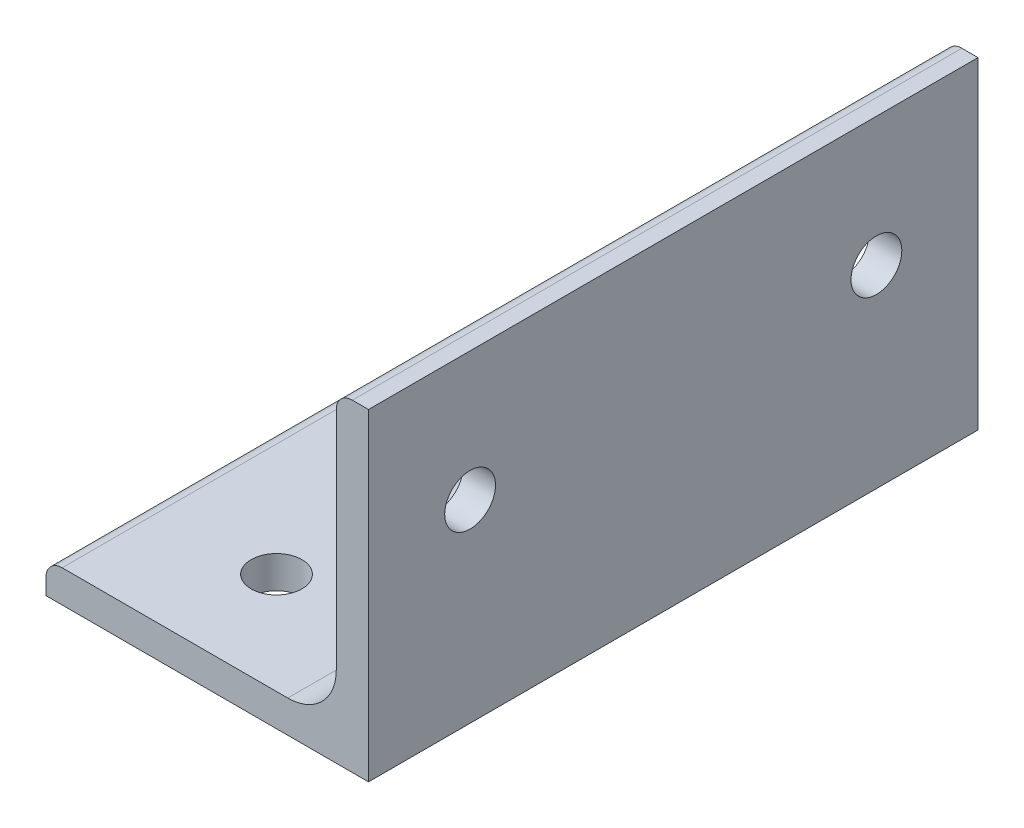
ISO-10303-21;
HEADER;
FILE_DESCRIPTION(('STEP AP214'),'2;1');
FILE_NAME('part.step','',(''),(''),'','','');
FILE_SCHEMA(('AUTOMOTIVE_DESIGN { 1 0 10303 214 1 1 1 1 }'));
ENDSEC;
DATA;
#1=APPLICATION_CONTEXT('core data for automotive mechanical design processes');
#2=APPLICATION_PROTOCOL_DEFINITION('international standard','automotive_design',2000,#1);
#3=PRODUCT_CONTEXT('',#1,'mechanical');
#4=PRODUCT('Part','Part','',(#3));
#5=PRODUCT_RELATED_PRODUCT_CATEGORY('part','',(#4));
#6=PRODUCT_DEFINITION_FORMATION('','',#4);
#7=PRODUCT_DEFINITION_CONTEXT('part definition',#1,'design');
#8=PRODUCT_DEFINITION('design','',#6,#7);
#9=PRODUCT_DEFINITION_SHAPE('','',#8);
#10=(LENGTH_UNIT() NAMED_UNIT(*) SI_UNIT(.MILLI.,.METRE.));
#11=(NAMED_UNIT(*) PLANE_ANGLE_UNIT() SI_UNIT($,.RADIAN.));
#12=(NAMED_UNIT(*) SI_UNIT($,.STERADIAN.) SOLID_ANGLE_UNIT());
#13=UNCERTAINTY_MEASURE_WITH_UNIT(LENGTH_MEASURE(1.E-05),#10,'distance_accuracy_value','');
#14=(GEOMETRIC_REPRESENTATION_CONTEXT(3) GLOBAL_UNCERTAINTY_ASSIGNED_CONTEXT((#13)) GLOBAL_UNIT_ASSIGNED_CONTEXT((#10,
#11,#12)) REPRESENTATION_CONTEXT('',''));
#15=CARTESIAN_POINT('',(0.,0.,0.));
#16=DIRECTION('',(0.,0.,1.));
#17=DIRECTION('',(1.,0.,0.));
#18=AXIS2_PLACEMENT_3D('',#15,#16,#17);
#19=CARTESIAN_POINT('',(-15.875,-14.2875,304.8));
#20=DIRECTION('',(1.,0.,0.));
#21=DIRECTION('',(0.,0.,-1.));
#22=AXIS2_PLACEMENT_3D('',#19,#20,#21);
#23=PLANE('',#22);
#24=DIRECTION('',(0.,1.,0.));
#25=VECTOR('',#24,1.);
#26=CARTESIAN_POINT('',(-15.875,-14.2875,244.8));
#27=LINE('',#26,#25);
#28=CARTESIAN_POINT('',(-15.875,-15.875,244.8));
#29=VERTEX_POINT('',#28);
#30=CARTESIAN_POINT('',(-15.875,-14.2875,244.8));
#31=VERTEX_POINT('',#30);
#32=EDGE_CURVE('E54',#29,#31,#27,.T.);
#33=ORIENTED_EDGE('',*,*,#32,.F.);
#34=DIRECTION('',(0.,0.,-1.));
#35=VECTOR('',#34,1.);
#36=CARTESIAN_POINT('',(-15.875,-15.875,304.8));
#37=LINE('',#36,#35);
#38=CARTESIAN_POINT('',(-15.875,-15.875,304.8));
#39=VERTEX_POINT('',#38);
#40=EDGE_CURVE('E48',#39,#29,#37,.T.);
#41=ORIENTED_EDGE('',*,*,#40,.F.);
#42=DIRECTION('',(0.,-1.,0.));
#43=VECTOR('',#42,1.);
#44=CARTESIAN_POINT('',(-15.875,-14.2875,304.8));
#45=LINE('',#44,#43);
#46=CARTESIAN_POINT('',(-15.875,-14.2875,304.8));
#47=VERTEX_POINT('',#46);
#48=EDGE_CURVE('E168',#47,#39,#45,.T.);
#49=ORIENTED_EDGE('',*,*,#48,.F.);
#50=DIRECTION('',(0.,0.,-1.));
#51=VECTOR('',#50,1.);
#52=CARTESIAN_POINT('',(-15.875,-14.2875,304.8));
#53=LINE('',#52,#51);
#54=EDGE_CURVE('E151',#47,#31,#53,.T.);
#55=ORIENTED_EDGE('',*,*,#54,.T.);
#56=EDGE_LOOP('',(#33,#41,#49,#55));
#57=FACE_BOUND('',#56,.T.);
#58=ADVANCED_FACE('F41',(#57),#23,.F.);
#59=CARTESIAN_POINT('',(-15.875,-15.875,304.8));
#60=DIRECTION('',(0.,1.,0.));
#61=DIRECTION('',(-1.,0.,0.));
#62=AXIS2_PLACEMENT_3D('',#59,#60,#61);
#63=PLANE('',#62);
#64=CARTESIAN_POINT('',(-3.18135,-15.875,254.8));
#65=DIRECTION('',(0.,1.,0.));
#66=DIRECTION('',(-1.,0.,0.));
#67=AXIS2_PLACEMENT_3D('',#64,#65,#66);
#68=CIRCLE('',#67,2.5);
#69=CARTESIAN_POINT('',(-5.68135,-15.875,254.8));
#70=VERTEX_POINT('',#69);
#71=EDGE_CURVE('E188',#70,#70,#68,.T.);
#72=ORIENTED_EDGE('',*,*,#71,.T.);
#73=EDGE_LOOP('',(#72));
#74=FACE_BOUND('',#73,.T.);
#75=CARTESIAN_POINT('',(-3.18135,-15.875,294.8));
#76=DIRECTION('',(0.,1.,0.));
#77=DIRECTION('',(-1.,0.,0.));
#78=AXIS2_PLACEMENT_3D('',#75,#76,#77);
#79=CIRCLE('',#78,2.5);
#80=CARTESIAN_POINT('',(-5.68134999999999,-15.875,294.8));
#81=VERTEX_POINT('',#80);
#82=EDGE_CURVE('E193',#81,#81,#79,.T.);
#83=ORIENTED_EDGE('',*,*,#82,.T.);
#84=EDGE_LOOP('',(#83));
#85=FACE_BOUND('',#84,.T.);
#86=DIRECTION('',(1.,0.,0.));
#87=VECTOR('',#86,1.);
#88=CARTESIAN_POINT('',(15.875,-15.875,244.8));
#89=LINE('',#88,#87);
#90=CARTESIAN_POINT('',(15.875,-15.875,244.8));
#91=VERTEX_POINT('',#90);
#92=EDGE_CURVE('E112',#29,#91,#89,.T.);
#93=ORIENTED_EDGE('',*,*,#92,.T.);
#94=DIRECTION('',(0.,0.,-1.));
#95=VECTOR('',#94,1.);
#96=CARTESIAN_POINT('',(15.875,-15.875,304.8));
#97=LINE('',#96,#95);
#98=CARTESIAN_POINT('',(15.875,-15.875,304.8));
#99=VERTEX_POINT('',#98);
#100=EDGE_CURVE('E125',#99,#91,#97,.T.);
#101=ORIENTED_EDGE('',*,*,#100,.F.);
#102=DIRECTION('',(1.,0.,0.));
#103=VECTOR('',#102,1.);
#104=CARTESIAN_POINT('',(-15.875,-15.875,304.8));
#105=LINE('',#104,#103);
#106=EDGE_CURVE('E166',#39,#99,#105,.T.);
#107=ORIENTED_EDGE('',*,*,#106,.F.);
#108=ORIENTED_EDGE('',*,*,#40,.T.);
#109=EDGE_LOOP('',(#93,#101,#107,#108));
#110=FACE_BOUND('',#109,.T.);
#111=ADVANCED_FACE('F124',(#74,#85,#110),#63,.F.);
#112=CARTESIAN_POINT('',(15.875,-15.875,304.8));
#113=DIRECTION('',(-1.,0.,0.));
#114=DIRECTION('',(0.,-1.,0.));
#115=AXIS2_PLACEMENT_3D('',#112,#113,#114);
#116=PLANE('',#115);
#117=CARTESIAN_POINT('',(15.875,3.18135,294.8));
#118=DIRECTION('',(-1.,0.,0.));
#119=DIRECTION('',(0.,-1.,0.));
#120=AXIS2_PLACEMENT_3D('',#117,#118,#119);
#121=CIRCLE('',#120,2.50000000000002);
#122=CARTESIAN_POINT('',(15.875,0.681349999999979,294.8));
#123=VERTEX_POINT('',#122);
#124=EDGE_CURVE('E119',#123,#123,#121,.T.);
#125=ORIENTED_EDGE('',*,*,#124,.T.);
#126=EDGE_LOOP('',(#125));
#127=FACE_BOUND('',#126,.T.);
#128=CARTESIAN_POINT('',(15.875,3.18135,254.8));
#129=DIRECTION('',(-1.,0.,0.));
#130=DIRECTION('',(0.,-1.,0.));
#131=AXIS2_PLACEMENT_3D('',#128,#129,#130);
#132=CIRCLE('',#131,2.50000000000002);
#133=CARTESIAN_POINT('',(15.875,0.681349999999979,254.8));
#134=VERTEX_POINT('',#133);
#135=EDGE_CURVE('E181',#134,#134,#132,.T.);
#136=ORIENTED_EDGE('',*,*,#135,.T.);
#137=EDGE_LOOP('',(#136));
#138=FACE_BOUND('',#137,.T.);
#139=DIRECTION('',(0.,1.,0.));
#140=VECTOR('',#139,1.);
#141=CARTESIAN_POINT('',(15.875,-15.875,244.8));
#142=LINE('',#141,#140);
#143=CARTESIAN_POINT('',(15.875,15.875,244.8));
#144=VERTEX_POINT('',#143);
#145=EDGE_CURVE('E109',#91,#144,#142,.T.);
#146=ORIENTED_EDGE('',*,*,#145,.T.);
#147=DIRECTION('',(0.,0.,-1.));
#148=VECTOR('',#147,1.);
#149=CARTESIAN_POINT('',(15.875,15.875,304.8));
#150=LINE('',#149,#148);
#151=CARTESIAN_POINT('',(15.875,15.875,304.8));
#152=VERTEX_POINT('',#151);
#153=EDGE_CURVE('E132',#152,#144,#150,.T.);
#154=ORIENTED_EDGE('',*,*,#153,.F.);
#155=DIRECTION('',(0.,1.,0.));
#156=VECTOR('',#155,1.);
#157=CARTESIAN_POINT('',(15.875,-15.875,304.8));
#158=LINE('',#157,#156);
#159=EDGE_CURVE('E131',#99,#152,#158,.T.);
#160=ORIENTED_EDGE('',*,*,#159,.F.);
#161=ORIENTED_EDGE('',*,*,#100,.T.);
#162=EDGE_LOOP('',(#146,#154,#160,#161));
#163=FACE_BOUND('',#162,.T.);
#164=ADVANCED_FACE('F130',(#127,#138,#163),#116,.F.);
#165=CARTESIAN_POINT('',(14.2875,15.875,304.8));
#166=DIRECTION('',(0.,-1.,0.));
#167=DIRECTION('',(1.,0.,0.));
#168=AXIS2_PLACEMENT_3D('',#165,#166,#167);
#169=PLANE('',#168);
#170=DIRECTION('',(1.,0.,0.));
#171=VECTOR('',#170,1.);
#172=CARTESIAN_POINT('',(14.2875,15.875,244.8));
#173=LINE('',#172,#171);
#174=CARTESIAN_POINT('',(14.2875,15.875,244.8));
#175=VERTEX_POINT('',#174);
#176=EDGE_CURVE('E114',#175,#144,#173,.T.);
#177=ORIENTED_EDGE('',*,*,#176,.F.);
#178=DIRECTION('',(0.,0.,-1.));
#179=VECTOR('',#178,1.);
#180=CARTESIAN_POINT('',(14.2875,15.875,304.8));
#181=LINE('',#180,#179);
#182=CARTESIAN_POINT('',(14.2875,15.875,304.8));
#183=VERTEX_POINT('',#182);
#184=EDGE_CURVE('E134',#183,#175,#181,.T.);
#185=ORIENTED_EDGE('',*,*,#184,.F.);
#186=DIRECTION('',(-1.,0.,0.));
#187=VECTOR('',#186,1.);
#188=CARTESIAN_POINT('',(14.2875,15.875,304.8));
#189=LINE('',#188,#187);
#190=EDGE_CURVE('E163',#152,#183,#189,.T.);
#191=ORIENTED_EDGE('',*,*,#190,.F.);
#192=ORIENTED_EDGE('',*,*,#153,.T.);
#193=EDGE_LOOP('',(#177,#185,#191,#192));
#194=FACE_BOUND('',#193,.T.);
#195=ADVANCED_FACE('F226',(#194),#169,.F.);
#196=CARTESIAN_POINT('',(14.2875,14.2875,304.8));
#197=DIRECTION('',(0.,0.,-1.));
#198=DIRECTION('',(-1.,0.,0.));
#199=AXIS2_PLACEMENT_3D('',#196,#197,#198);
#200=CYLINDRICAL_SURFACE('',#199,1.5875);
#201=CARTESIAN_POINT('',(14.2875,14.2875,244.8));
#202=DIRECTION('',(0.,0.,-1.));
#203=DIRECTION('',(-1.,0.,0.));
#204=AXIS2_PLACEMENT_3D('',#201,#202,#203);
#205=CIRCLE('',#204,1.5875);
#206=CARTESIAN_POINT('',(12.7,14.2875,244.8));
#207=VERTEX_POINT('',#206);
#208=EDGE_CURVE('E172',#207,#175,#205,.T.);
#209=ORIENTED_EDGE('',*,*,#208,.F.);
#210=DIRECTION('',(0.,0.,-1.));
#211=VECTOR('',#210,1.);
#212=CARTESIAN_POINT('',(12.7,14.2875,304.8));
#213=LINE('',#212,#211);
#214=CARTESIAN_POINT('',(12.7,14.2875,304.8));
#215=VERTEX_POINT('',#214);
#216=EDGE_CURVE('E139',#215,#207,#213,.T.);
#217=ORIENTED_EDGE('',*,*,#216,.F.);
#218=CARTESIAN_POINT('',(14.2875,14.2875,304.8));
#219=DIRECTION('',(0.,0.,1.));
#220=DIRECTION('',(-1.,0.,0.));
#221=AXIS2_PLACEMENT_3D('',#218,#219,#220);
#222=CIRCLE('',#221,1.5875);
#223=EDGE_CURVE('E161',#183,#215,#222,.T.);
#224=ORIENTED_EDGE('',*,*,#223,.F.);
#225=ORIENTED_EDGE('',*,*,#184,.T.);
#226=EDGE_LOOP('',(#209,#217,#224,#225));
#227=FACE_BOUND('',#226,.T.);
#228=ADVANCED_FACE('F231',(#227),#200,.T.);
#229=CARTESIAN_POINT('',(12.7,14.2875,304.8));
#230=DIRECTION('',(1.,0.,0.));
#231=DIRECTION('',(0.,1.,0.));
#232=AXIS2_PLACEMENT_3D('',#229,#230,#231);
#233=PLANE('',#232);
#234=CARTESIAN_POINT('',(12.7,3.18135,294.8));
#235=DIRECTION('',(-1.,0.,0.));
#236=DIRECTION('',(0.,-1.,0.));
#237=AXIS2_PLACEMENT_3D('',#234,#235,#236);
#238=CIRCLE('',#237,2.50000000000002);
#239=CARTESIAN_POINT('',(12.7,0.681349999999978,294.8));
#240=VERTEX_POINT('',#239);
#241=EDGE_CURVE('E184',#240,#240,#238,.T.);
#242=ORIENTED_EDGE('',*,*,#241,.F.);
#243=EDGE_LOOP('',(#242));
#244=FACE_BOUND('',#243,.T.);
#245=CARTESIAN_POINT('',(12.7,3.18135,254.8));
#246=DIRECTION('',(-1.,0.,0.));
#247=DIRECTION('',(0.,-1.,0.));
#248=AXIS2_PLACEMENT_3D('',#245,#246,#247);
#249=CIRCLE('',#248,2.50000000000002);
#250=CARTESIAN_POINT('',(12.7,0.681349999999978,254.8));
#251=VERTEX_POINT('',#250);
#252=EDGE_CURVE('E185',#251,#251,#249,.T.);
#253=ORIENTED_EDGE('',*,*,#252,.F.);
#254=EDGE_LOOP('',(#253));
#255=FACE_BOUND('',#254,.T.);
#256=DIRECTION('',(0.,1.,0.));
#257=VECTOR('',#256,1.);
#258=CARTESIAN_POINT('',(12.7,14.2875,244.8));
#259=LINE('',#258,#257);
#260=CARTESIAN_POINT('',(12.7,-7.9248,244.8));
#261=VERTEX_POINT('',#260);
#262=EDGE_CURVE('E174',#261,#207,#259,.T.);
#263=ORIENTED_EDGE('',*,*,#262,.F.);
#264=DIRECTION('',(0.,0.,-1.));
#265=VECTOR('',#264,1.);
#266=CARTESIAN_POINT('',(12.7,-7.9248,304.8));
#267=LINE('',#266,#265);
#268=CARTESIAN_POINT('',(12.7,-7.9248,304.8));
#269=VERTEX_POINT('',#268);
#270=EDGE_CURVE('E142',#269,#261,#267,.T.);
#271=ORIENTED_EDGE('',*,*,#270,.F.);
#272=DIRECTION('',(0.,-1.,0.));
#273=VECTOR('',#272,1.);
#274=CARTESIAN_POINT('',(12.7,14.2875,304.8));
#275=LINE('',#274,#273);
#276=EDGE_CURVE('E159',#215,#269,#275,.T.);
#277=ORIENTED_EDGE('',*,*,#276,.F.);
#278=ORIENTED_EDGE('',*,*,#216,.T.);
#279=EDGE_LOOP('',(#263,#271,#277,#278));
#280=FACE_BOUND('',#279,.T.);
#281=ADVANCED_FACE('F237',(#244,#255,#280),#233,.F.);
#282=CARTESIAN_POINT('',(7.92480000000001,-7.9248,304.8));
#283=DIRECTION('',(0.,0.,-1.));
#284=DIRECTION('',(-1.,0.,0.));
#285=AXIS2_PLACEMENT_3D('',#282,#283,#284);
#286=CYLINDRICAL_SURFACE('',#285,4.7752);
#287=CARTESIAN_POINT('',(7.92480000000001,-7.9248,244.8));
#288=DIRECTION('',(0.,0.,-1.));
#289=DIRECTION('',(-1.,0.,0.));
#290=AXIS2_PLACEMENT_3D('',#287,#288,#289);
#291=CIRCLE('',#290,4.7752);
#292=CARTESIAN_POINT('',(7.92480000000001,-12.7,244.8));
#293=VERTEX_POINT('',#292);
#294=EDGE_CURVE('E176',#293,#261,#291,.F.);
#295=ORIENTED_EDGE('',*,*,#294,.F.);
#296=DIRECTION('',(0.,0.,-1.));
#297=VECTOR('',#296,1.);
#298=CARTESIAN_POINT('',(7.92480000000001,-12.7,304.8));
#299=LINE('',#298,#297);
#300=CARTESIAN_POINT('',(7.92480000000001,-12.7,304.8));
#301=VERTEX_POINT('',#300);
#302=EDGE_CURVE('E145',#301,#293,#299,.T.);
#303=ORIENTED_EDGE('',*,*,#302,.F.);
#304=CARTESIAN_POINT('',(7.92480000000001,-7.9248,304.8));
#305=DIRECTION('',(0.,0.,-1.));
#306=DIRECTION('',(-1.,0.,0.));
#307=AXIS2_PLACEMENT_3D('',#304,#305,#306);
#308=CIRCLE('',#307,4.7752);
#309=EDGE_CURVE('E157',#269,#301,#308,.T.);
#310=ORIENTED_EDGE('',*,*,#309,.F.);
#311=ORIENTED_EDGE('',*,*,#270,.T.);
#312=EDGE_LOOP('',(#295,#303,#310,#311));
#313=FACE_BOUND('',#312,.T.);
#314=ADVANCED_FACE('F210',(#313),#286,.F.);
#315=CARTESIAN_POINT('',(7.92480000000001,-12.7,304.8));
#316=DIRECTION('',(0.,-1.,0.));
#317=DIRECTION('',(1.,0.,0.));
#318=AXIS2_PLACEMENT_3D('',#315,#316,#317);
#319=PLANE('',#318);
#320=CARTESIAN_POINT('',(-3.18135,-12.7,254.8));
#321=DIRECTION('',(0.,1.,0.));
#322=DIRECTION('',(-1.,0.,0.));
#323=AXIS2_PLACEMENT_3D('',#320,#321,#322);
#324=CIRCLE('',#323,2.5);
#325=CARTESIAN_POINT('',(-5.68135,-12.7,254.8));
#326=VERTEX_POINT('',#325);
#327=EDGE_CURVE('E196',#326,#326,#324,.T.);
#328=ORIENTED_EDGE('',*,*,#327,.F.);
#329=EDGE_LOOP('',(#328));
#330=FACE_BOUND('',#329,.T.);
#331=CARTESIAN_POINT('',(-3.18135,-12.7,294.8));
#332=DIRECTION('',(0.,1.,0.));
#333=DIRECTION('',(-1.,0.,0.));
#334=AXIS2_PLACEMENT_3D('',#331,#332,#333);
#335=CIRCLE('',#334,2.5);
#336=CARTESIAN_POINT('',(-5.68134999999999,-12.7,294.8));
#337=VERTEX_POINT('',#336);
#338=EDGE_CURVE('E197',#337,#337,#335,.T.);
#339=ORIENTED_EDGE('',*,*,#338,.F.);
#340=EDGE_LOOP('',(#339));
#341=FACE_BOUND('',#340,.T.);
#342=DIRECTION('',(1.,0.,0.));
#343=VECTOR('',#342,1.);
#344=CARTESIAN_POINT('',(7.92480000000001,-12.7,244.8));
#345=LINE('',#344,#343);
#346=CARTESIAN_POINT('',(-14.2875,-12.7,244.8));
#347=VERTEX_POINT('',#346);
#348=EDGE_CURVE('E128',#347,#293,#345,.T.);
#349=ORIENTED_EDGE('',*,*,#348,.F.);
#350=DIRECTION('',(0.,0.,-1.));
#351=VECTOR('',#350,1.);
#352=CARTESIAN_POINT('',(-14.2875,-12.7,304.8));
#353=LINE('',#352,#351);
#354=CARTESIAN_POINT('',(-14.2875,-12.7,304.8));
#355=VERTEX_POINT('',#354);
#356=EDGE_CURVE('E148',#355,#347,#353,.T.);
#357=ORIENTED_EDGE('',*,*,#356,.F.);
#358=DIRECTION('',(-1.,0.,0.));
#359=VECTOR('',#358,1.);
#360=CARTESIAN_POINT('',(7.92480000000001,-12.7,304.8));
#361=LINE('',#360,#359);
#362=EDGE_CURVE('E155',#301,#355,#361,.T.);
#363=ORIENTED_EDGE('',*,*,#362,.F.);
#364=ORIENTED_EDGE('',*,*,#302,.T.);
#365=EDGE_LOOP('',(#349,#357,#363,#364));
#366=FACE_BOUND('',#365,.T.);
#367=ADVANCED_FACE('F206',(#330,#341,#366),#319,.F.);
#368=CARTESIAN_POINT('',(-14.2875,-14.2875,304.8));
#369=DIRECTION('',(0.,0.,-1.));
#370=DIRECTION('',(-1.,0.,0.));
#371=AXIS2_PLACEMENT_3D('',#368,#369,#370);
#372=CYLINDRICAL_SURFACE('',#371,1.5875);
#373=CARTESIAN_POINT('',(-14.2875,-14.2875,244.8));
#374=DIRECTION('',(0.,0.,-1.));
#375=DIRECTION('',(-1.,0.,0.));
#376=AXIS2_PLACEMENT_3D('',#373,#374,#375);
#377=CIRCLE('',#376,1.5875);
#378=EDGE_CURVE('E12',#31,#347,#377,.T.);
#379=ORIENTED_EDGE('',*,*,#378,.F.);
#380=ORIENTED_EDGE('',*,*,#54,.F.);
#381=CARTESIAN_POINT('',(-14.2875,-14.2875,304.8));
#382=DIRECTION('',(0.,0.,1.));
#383=DIRECTION('',(-1.,0.,0.));
#384=AXIS2_PLACEMENT_3D('',#381,#382,#383);
#385=CIRCLE('',#384,1.5875);
#386=EDGE_CURVE('E62',#355,#47,#385,.T.);
#387=ORIENTED_EDGE('',*,*,#386,.F.);
#388=ORIENTED_EDGE('',*,*,#356,.T.);
#389=EDGE_LOOP('',(#379,#380,#387,#388));
#390=FACE_BOUND('',#389,.T.);
#391=ADVANCED_FACE('F209',(#390),#372,.T.);
#392=CARTESIAN_POINT('',(14.2875,14.2875,304.8));
#393=DIRECTION('',(0.,0.,-1.));
#394=DIRECTION('',(-1.,0.,0.));
#395=AXIS2_PLACEMENT_3D('',#392,#393,#394);
#396=PLANE('',#395);
#397=ORIENTED_EDGE('',*,*,#48,.T.);
#398=ORIENTED_EDGE('',*,*,#106,.T.);
#399=ORIENTED_EDGE('',*,*,#159,.T.);
#400=ORIENTED_EDGE('',*,*,#190,.T.);
#401=ORIENTED_EDGE('',*,*,#223,.T.);
#402=ORIENTED_EDGE('',*,*,#276,.T.);
#403=ORIENTED_EDGE('',*,*,#309,.T.);
#404=ORIENTED_EDGE('',*,*,#362,.T.);
#405=ORIENTED_EDGE('',*,*,#386,.T.);
#406=EDGE_LOOP('',(#397,#398,#399,#400,#401,#402,#403,#404,#405));
#407=FACE_BOUND('',#406,.T.);
#408=ADVANCED_FACE('F222',(#407),#396,.F.);
#409=CARTESIAN_POINT('',(14.2875,14.2875,244.8));
#410=DIRECTION('',(0.,0.,-1.));
#411=DIRECTION('',(-1.,0.,0.));
#412=AXIS2_PLACEMENT_3D('',#409,#410,#411);
#413=PLANE('',#412);
#414=ORIENTED_EDGE('',*,*,#32,.T.);
#415=ORIENTED_EDGE('',*,*,#378,.T.);
#416=ORIENTED_EDGE('',*,*,#348,.T.);
#417=ORIENTED_EDGE('',*,*,#294,.T.);
#418=ORIENTED_EDGE('',*,*,#262,.T.);
#419=ORIENTED_EDGE('',*,*,#208,.T.);
#420=ORIENTED_EDGE('',*,*,#176,.T.);
#421=ORIENTED_EDGE('',*,*,#145,.F.);
#422=ORIENTED_EDGE('',*,*,#92,.F.);
#423=EDGE_LOOP('',(#414,#415,#416,#417,#418,#419,#420,#421,#422));
#424=FACE_BOUND('',#423,.T.);
#425=ADVANCED_FACE('F111',(#424),#413,.T.);
#426=CARTESIAN_POINT('',(114.3,3.18135000000002,254.8));
#427=DIRECTION('',(-1.,0.,0.));
#428=DIRECTION('',(0.,-1.,0.));
#429=AXIS2_PLACEMENT_3D('',#426,#427,#428);
#430=CYLINDRICAL_SURFACE('',#429,2.50000000000002);
#431=ORIENTED_EDGE('',*,*,#252,.T.);
#432=EDGE_LOOP('',(#431));
#433=FACE_BOUND('',#432,.T.);
#434=ORIENTED_EDGE('',*,*,#135,.F.);
#435=EDGE_LOOP('',(#434));
#436=FACE_BOUND('',#435,.T.);
#437=ADVANCED_FACE('F296',(#433,#436),#430,.F.);
#438=CARTESIAN_POINT('',(114.3,3.18135000000002,294.8));
#439=DIRECTION('',(-1.,0.,0.));
#440=DIRECTION('',(0.,-1.,0.));
#441=AXIS2_PLACEMENT_3D('',#438,#439,#440);
#442=CYLINDRICAL_SURFACE('',#441,2.50000000000002);
#443=ORIENTED_EDGE('',*,*,#241,.T.);
#444=EDGE_LOOP('',(#443));
#445=FACE_BOUND('',#444,.T.);
#446=ORIENTED_EDGE('',*,*,#124,.F.);
#447=EDGE_LOOP('',(#446));
#448=FACE_BOUND('',#447,.T.);
#449=ADVANCED_FACE('F304',(#445,#448),#442,.F.);
#450=CARTESIAN_POINT('',(-3.18134999999999,-114.3,294.8));
#451=DIRECTION('',(0.,1.,0.));
#452=DIRECTION('',(-1.,0.,0.));
#453=AXIS2_PLACEMENT_3D('',#450,#451,#452);
#454=CYLINDRICAL_SURFACE('',#453,2.5);
#455=ORIENTED_EDGE('',*,*,#338,.T.);
#456=EDGE_LOOP('',(#455));
#457=FACE_BOUND('',#456,.T.);
#458=ORIENTED_EDGE('',*,*,#82,.F.);
#459=EDGE_LOOP('',(#458));
#460=FACE_BOUND('',#459,.T.);
#461=ADVANCED_FACE('F312',(#457,#460),#454,.F.);
#462=CARTESIAN_POINT('',(-3.18134999999999,-114.3,254.8));
#463=DIRECTION('',(0.,1.,0.));
#464=DIRECTION('',(-1.,0.,0.));
#465=AXIS2_PLACEMENT_3D('',#462,#463,#464);
#466=CYLINDRICAL_SURFACE('',#465,2.5);
#467=ORIENTED_EDGE('',*,*,#327,.T.);
#468=EDGE_LOOP('',(#467));
#469=FACE_BOUND('',#468,.T.);
#470=ORIENTED_EDGE('',*,*,#71,.F.);
#471=EDGE_LOOP('',(#470));
#472=FACE_BOUND('',#471,.T.);
#473=ADVANCED_FACE('F203',(#469,#472),#466,.F.);
#474=CLOSED_SHELL('',(#58,#111,#164,#195,#228,#281,#314,#367,#391,#408,#425,#437,#449,#461,#473));
#475=MANIFOLD_SOLID_BREP('B2',#474);
#476=ADVANCED_BREP_SHAPE_REPRESENTATION('',(#18,#475),#14);
#477=SHAPE_DEFINITION_REPRESENTATION(#9,#476);
ENDSEC;
END-ISO-10303-21;
